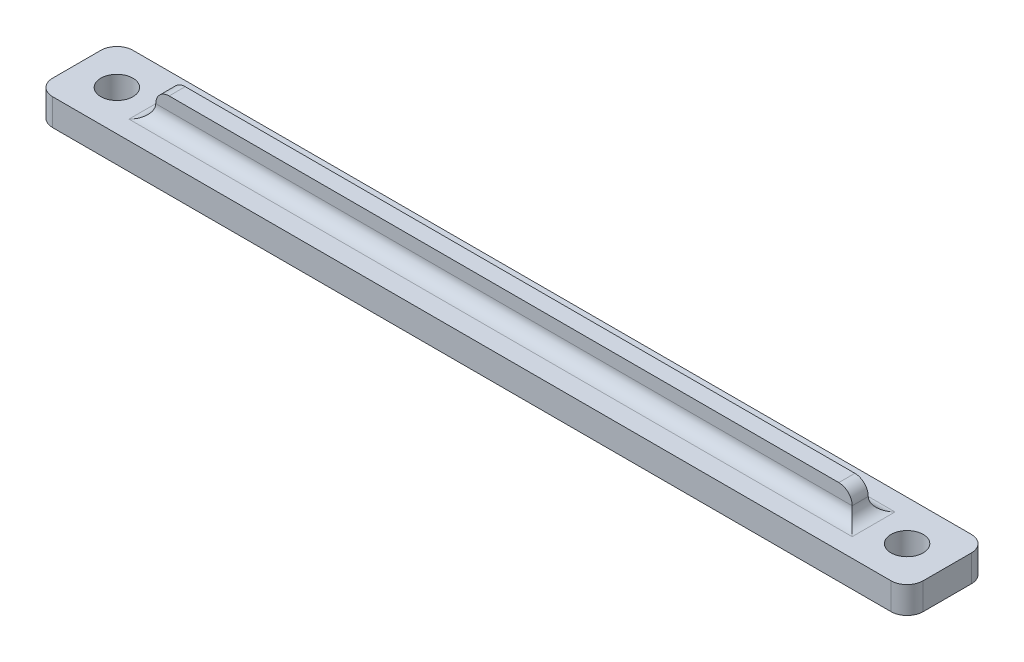
ISO-10303-21;
HEADER;
FILE_DESCRIPTION(('STEP AP214'),'2;1');
FILE_NAME('part.step','',(''),(''),'','','');
FILE_SCHEMA(('AUTOMOTIVE_DESIGN { 1 0 10303 214 1 1 1 1 }'));
ENDSEC;
DATA;
#1=APPLICATION_CONTEXT('core data for automotive mechanical design processes');
#2=APPLICATION_PROTOCOL_DEFINITION('international standard','automotive_design',2000,#1);
#3=PRODUCT_CONTEXT('',#1,'mechanical');
#4=PRODUCT('Part','Part','',(#3));
#5=PRODUCT_RELATED_PRODUCT_CATEGORY('part','',(#4));
#6=PRODUCT_DEFINITION_FORMATION('','',#4);
#7=PRODUCT_DEFINITION_CONTEXT('part definition',#1,'design');
#8=PRODUCT_DEFINITION('design','',#6,#7);
#9=PRODUCT_DEFINITION_SHAPE('','',#8);
#10=(LENGTH_UNIT() NAMED_UNIT(*) SI_UNIT(.MILLI.,.METRE.));
#11=(NAMED_UNIT(*) PLANE_ANGLE_UNIT() SI_UNIT($,.RADIAN.));
#12=(NAMED_UNIT(*) SI_UNIT($,.STERADIAN.) SOLID_ANGLE_UNIT());
#13=UNCERTAINTY_MEASURE_WITH_UNIT(LENGTH_MEASURE(1.E-05),#10,'distance_accuracy_value','');
#14=(GEOMETRIC_REPRESENTATION_CONTEXT(3) GLOBAL_UNCERTAINTY_ASSIGNED_CONTEXT((#13)) GLOBAL_UNIT_ASSIGNED_CONTEXT((#10,
#11,#12)) REPRESENTATION_CONTEXT('',''));
#15=CARTESIAN_POINT('',(0.,0.,0.));
#16=DIRECTION('',(0.,0.,1.));
#17=DIRECTION('',(1.,0.,0.));
#18=AXIS2_PLACEMENT_3D('',#15,#16,#17);
#19=CARTESIAN_POINT('',(0.,2.,0.));
#20=DIRECTION('',(0.,1.,0.));
#21=DIRECTION('',(0.,0.,1.));
#22=AXIS2_PLACEMENT_3D('',#19,#20,#21);
#23=PLANE('',#22);
#24=CARTESIAN_POINT('',(3.,2.,3.));
#25=DIRECTION('',(0.,1.,0.));
#26=DIRECTION('',(0.,0.,1.));
#27=AXIS2_PLACEMENT_3D('',#24,#25,#26);
#28=CIRCLE('',#27,1.2);
#29=CARTESIAN_POINT('',(3.,2.,4.2));
#30=VERTEX_POINT('',#29);
#31=EDGE_CURVE('E266',#30,#30,#28,.T.);
#32=ORIENTED_EDGE('',*,*,#31,.F.);
#33=EDGE_LOOP('',(#32));
#34=FACE_BOUND('',#33,.T.);
#35=CARTESIAN_POINT('',(62.,2.,3.));
#36=DIRECTION('',(0.,1.,0.));
#37=DIRECTION('',(0.,0.,1.));
#38=AXIS2_PLACEMENT_3D('',#35,#36,#37);
#39=CIRCLE('',#38,1.2);
#40=CARTESIAN_POINT('',(62.,2.,4.2));
#41=VERTEX_POINT('',#40);
#42=EDGE_CURVE('E276',#41,#41,#39,.T.);
#43=ORIENTED_EDGE('',*,*,#42,.F.);
#44=EDGE_LOOP('',(#43));
#45=FACE_BOUND('',#44,.T.);
#46=DIRECTION('',(0.,0.,1.));
#47=VECTOR('',#46,1.);
#48=CARTESIAN_POINT('',(0.,2.,0.));
#49=LINE('',#48,#47);
#50=CARTESIAN_POINT('',(0.,2.,1.2));
#51=VERTEX_POINT('',#50);
#52=CARTESIAN_POINT('',(0.,2.,4.8));
#53=VERTEX_POINT('',#52);
#54=EDGE_CURVE('E171',#51,#53,#49,.T.);
#55=ORIENTED_EDGE('',*,*,#54,.T.);
#56=CARTESIAN_POINT('',(1.2,2.,4.8));
#57=DIRECTION('',(0.,1.,0.));
#58=DIRECTION('',(0.,0.,1.));
#59=AXIS2_PLACEMENT_3D('',#56,#57,#58);
#60=CIRCLE('',#59,1.2);
#61=CARTESIAN_POINT('',(1.2,2.,6.));
#62=VERTEX_POINT('',#61);
#63=EDGE_CURVE('E187',#53,#62,#60,.T.);
#64=ORIENTED_EDGE('',*,*,#63,.T.);
#65=DIRECTION('',(1.,0.,0.));
#66=VECTOR('',#65,1.);
#67=CARTESIAN_POINT('',(0.,2.,6.));
#68=LINE('',#67,#66);
#69=CARTESIAN_POINT('',(63.8,2.,6.));
#70=VERTEX_POINT('',#69);
#71=EDGE_CURVE('E153',#62,#70,#68,.T.);
#72=ORIENTED_EDGE('',*,*,#71,.T.);
#73=CARTESIAN_POINT('',(63.8,2.,4.8));
#74=DIRECTION('',(0.,1.,0.));
#75=DIRECTION('',(0.,0.,1.));
#76=AXIS2_PLACEMENT_3D('',#73,#74,#75);
#77=CIRCLE('',#76,1.2);
#78=CARTESIAN_POINT('',(65.,2.,4.8));
#79=VERTEX_POINT('',#78);
#80=EDGE_CURVE('E181',#70,#79,#77,.T.);
#81=ORIENTED_EDGE('',*,*,#80,.T.);
#82=DIRECTION('',(0.,0.,-1.));
#83=VECTOR('',#82,1.);
#84=CARTESIAN_POINT('',(65.,2.,0.));
#85=LINE('',#84,#83);
#86=CARTESIAN_POINT('',(65.,2.,1.2));
#87=VERTEX_POINT('',#86);
#88=EDGE_CURVE('E285',#79,#87,#85,.T.);
#89=ORIENTED_EDGE('',*,*,#88,.T.);
#90=CARTESIAN_POINT('',(63.8,2.,1.2));
#91=DIRECTION('',(0.,1.,0.));
#92=DIRECTION('',(0.,0.,1.));
#93=AXIS2_PLACEMENT_3D('',#90,#91,#92);
#94=CIRCLE('',#93,1.2);
#95=CARTESIAN_POINT('',(63.8,2.,0.));
#96=VERTEX_POINT('',#95);
#97=EDGE_CURVE('E183',#87,#96,#94,.T.);
#98=ORIENTED_EDGE('',*,*,#97,.T.);
#99=DIRECTION('',(-1.,0.,0.));
#100=VECTOR('',#99,1.);
#101=CARTESIAN_POINT('',(0.,2.,0.));
#102=LINE('',#101,#100);
#103=CARTESIAN_POINT('',(1.2,2.,0.));
#104=VERTEX_POINT('',#103);
#105=EDGE_CURVE('E172',#96,#104,#102,.T.);
#106=ORIENTED_EDGE('',*,*,#105,.T.);
#107=CARTESIAN_POINT('',(1.2,2.,1.2));
#108=DIRECTION('',(0.,1.,0.));
#109=DIRECTION('',(0.,0.,1.));
#110=AXIS2_PLACEMENT_3D('',#107,#108,#109);
#111=CIRCLE('',#110,1.2);
#112=EDGE_CURVE('E185',#104,#51,#111,.T.);
#113=ORIENTED_EDGE('',*,*,#112,.T.);
#114=EDGE_LOOP('',(#55,#64,#72,#81,#89,#98,#106,#113));
#115=FACE_BOUND('',#114,.T.);
#116=DIRECTION('',(-1.,0.,0.));
#117=VECTOR('',#116,1.);
#118=CARTESIAN_POINT('',(0.,2.,1.4));
#119=LINE('',#118,#117);
#120=CARTESIAN_POINT('',(5.50000000000001,2.,1.4));
#121=VERTEX_POINT('',#120);
#122=CARTESIAN_POINT('',(59.5,2.,1.4));
#123=VERTEX_POINT('',#122);
#124=EDGE_CURVE('E48',#121,#123,#119,.F.);
#125=ORIENTED_EDGE('',*,*,#124,.T.);
#126=DIRECTION('',(0.,0.,-1.));
#127=VECTOR('',#126,1.);
#128=CARTESIAN_POINT('',(59.5,2.,0.));
#129=LINE('',#128,#127);
#130=CARTESIAN_POINT('',(59.5,2.,4.6));
#131=VERTEX_POINT('',#130);
#132=EDGE_CURVE('E231',#123,#131,#129,.F.);
#133=ORIENTED_EDGE('',*,*,#132,.T.);
#134=DIRECTION('',(1.,0.,0.));
#135=VECTOR('',#134,1.);
#136=CARTESIAN_POINT('',(0.,2.,4.6));
#137=LINE('',#136,#135);
#138=CARTESIAN_POINT('',(5.50000000000001,2.,4.6));
#139=VERTEX_POINT('',#138);
#140=EDGE_CURVE('E56',#131,#139,#137,.F.);
#141=ORIENTED_EDGE('',*,*,#140,.T.);
#142=DIRECTION('',(0.,0.,1.));
#143=VECTOR('',#142,1.);
#144=CARTESIAN_POINT('',(5.50000000000001,2.,0.));
#145=LINE('',#144,#143);
#146=EDGE_CURVE('E229',#139,#121,#145,.F.);
#147=ORIENTED_EDGE('',*,*,#146,.T.);
#148=EDGE_LOOP('',(#125,#133,#141,#147));
#149=FACE_BOUND('',#148,.T.);
#150=ADVANCED_FACE('F33',(#34,#45,#115,#149),#23,.T.);
#151=CARTESIAN_POINT('',(0.,2.,0.));
#152=DIRECTION('',(1.,0.,0.));
#153=DIRECTION('',(0.,0.,-1.));
#154=AXIS2_PLACEMENT_3D('',#151,#152,#153);
#155=PLANE('',#154);
#156=DIRECTION('',(0.,0.,1.));
#157=VECTOR('',#156,1.);
#158=CARTESIAN_POINT('',(0.,0.,0.));
#159=LINE('',#158,#157);
#160=CARTESIAN_POINT('',(0.,0.,1.2));
#161=VERTEX_POINT('',#160);
#162=CARTESIAN_POINT('',(0.,0.,4.8));
#163=VERTEX_POINT('',#162);
#164=EDGE_CURVE('E160',#161,#163,#159,.T.);
#165=ORIENTED_EDGE('',*,*,#164,.T.);
#166=DIRECTION('',(0.,-1.,0.));
#167=VECTOR('',#166,1.);
#168=CARTESIAN_POINT('',(0.,2.,4.8));
#169=LINE('',#168,#167);
#170=EDGE_CURVE('E138',#163,#53,#169,.F.);
#171=ORIENTED_EDGE('',*,*,#170,.T.);
#172=ORIENTED_EDGE('',*,*,#54,.F.);
#173=DIRECTION('',(0.,-1.,0.));
#174=VECTOR('',#173,1.);
#175=CARTESIAN_POINT('',(0.,2.,1.2));
#176=LINE('',#175,#174);
#177=EDGE_CURVE('E143',#51,#161,#176,.T.);
#178=ORIENTED_EDGE('',*,*,#177,.T.);
#179=EDGE_LOOP('',(#165,#171,#172,#178));
#180=FACE_BOUND('',#179,.T.);
#181=ADVANCED_FACE('F300',(#180),#155,.F.);
#182=CARTESIAN_POINT('',(0.,2.,6.));
#183=DIRECTION('',(0.,0.,-1.));
#184=DIRECTION('',(-1.,0.,0.));
#185=AXIS2_PLACEMENT_3D('',#182,#183,#184);
#186=PLANE('',#185);
#187=ORIENTED_EDGE('',*,*,#71,.F.);
#188=DIRECTION('',(0.,-1.,0.));
#189=VECTOR('',#188,1.);
#190=CARTESIAN_POINT('',(1.2,2.,6.));
#191=LINE('',#190,#189);
#192=CARTESIAN_POINT('',(1.2,0.,6.));
#193=VERTEX_POINT('',#192);
#194=EDGE_CURVE('E137',#62,#193,#191,.T.);
#195=ORIENTED_EDGE('',*,*,#194,.T.);
#196=DIRECTION('',(1.,0.,0.));
#197=VECTOR('',#196,1.);
#198=CARTESIAN_POINT('',(0.,0.,6.));
#199=LINE('',#198,#197);
#200=CARTESIAN_POINT('',(63.8,0.,6.));
#201=VERTEX_POINT('',#200);
#202=EDGE_CURVE('E150',#193,#201,#199,.T.);
#203=ORIENTED_EDGE('',*,*,#202,.T.);
#204=DIRECTION('',(0.,-1.,0.));
#205=VECTOR('',#204,1.);
#206=CARTESIAN_POINT('',(63.8,2.,6.));
#207=LINE('',#206,#205);
#208=EDGE_CURVE('E155',#201,#70,#207,.F.);
#209=ORIENTED_EDGE('',*,*,#208,.T.);
#210=EDGE_LOOP('',(#187,#195,#203,#209));
#211=FACE_BOUND('',#210,.T.);
#212=ADVANCED_FACE('F149',(#211),#186,.F.);
#213=CARTESIAN_POINT('',(65.,2.,0.));
#214=DIRECTION('',(-1.,0.,0.));
#215=DIRECTION('',(0.,0.,1.));
#216=AXIS2_PLACEMENT_3D('',#213,#214,#215);
#217=PLANE('',#216);
#218=DIRECTION('',(0.,0.,-1.));
#219=VECTOR('',#218,1.);
#220=CARTESIAN_POINT('',(65.,0.,0.));
#221=LINE('',#220,#219);
#222=CARTESIAN_POINT('',(65.,0.,4.8));
#223=VERTEX_POINT('',#222);
#224=CARTESIAN_POINT('',(65.,0.,1.2));
#225=VERTEX_POINT('',#224);
#226=EDGE_CURVE('E159',#223,#225,#221,.T.);
#227=ORIENTED_EDGE('',*,*,#226,.T.);
#228=DIRECTION('',(0.,-1.,0.));
#229=VECTOR('',#228,1.);
#230=CARTESIAN_POINT('',(65.,2.,1.2));
#231=LINE('',#230,#229);
#232=EDGE_CURVE('E197',#225,#87,#231,.F.);
#233=ORIENTED_EDGE('',*,*,#232,.T.);
#234=ORIENTED_EDGE('',*,*,#88,.F.);
#235=DIRECTION('',(0.,-1.,0.));
#236=VECTOR('',#235,1.);
#237=CARTESIAN_POINT('',(65.,2.,4.8));
#238=LINE('',#237,#236);
#239=EDGE_CURVE('E194',#79,#223,#238,.T.);
#240=ORIENTED_EDGE('',*,*,#239,.T.);
#241=EDGE_LOOP('',(#227,#233,#234,#240));
#242=FACE_BOUND('',#241,.T.);
#243=ADVANCED_FACE('F307',(#242),#217,.F.);
#244=CARTESIAN_POINT('',(0.,2.,0.));
#245=DIRECTION('',(0.,0.,1.));
#246=DIRECTION('',(1.,0.,0.));
#247=AXIS2_PLACEMENT_3D('',#244,#245,#246);
#248=PLANE('',#247);
#249=DIRECTION('',(-1.,0.,0.));
#250=VECTOR('',#249,1.);
#251=CARTESIAN_POINT('',(0.,0.,0.));
#252=LINE('',#251,#250);
#253=CARTESIAN_POINT('',(63.8,0.,0.));
#254=VERTEX_POINT('',#253);
#255=CARTESIAN_POINT('',(1.2,0.,0.));
#256=VERTEX_POINT('',#255);
#257=EDGE_CURVE('E163',#254,#256,#252,.T.);
#258=ORIENTED_EDGE('',*,*,#257,.T.);
#259=DIRECTION('',(0.,-1.,0.));
#260=VECTOR('',#259,1.);
#261=CARTESIAN_POINT('',(1.2,2.,0.));
#262=LINE('',#261,#260);
#263=EDGE_CURVE('E192',#256,#104,#262,.F.);
#264=ORIENTED_EDGE('',*,*,#263,.T.);
#265=ORIENTED_EDGE('',*,*,#105,.F.);
#266=DIRECTION('',(0.,-1.,0.));
#267=VECTOR('',#266,1.);
#268=CARTESIAN_POINT('',(63.8,2.,0.));
#269=LINE('',#268,#267);
#270=EDGE_CURVE('E189',#96,#254,#269,.T.);
#271=ORIENTED_EDGE('',*,*,#270,.T.);
#272=EDGE_LOOP('',(#258,#264,#265,#271));
#273=FACE_BOUND('',#272,.T.);
#274=ADVANCED_FACE('F302',(#273),#248,.F.);
#275=CARTESIAN_POINT('',(0.,0.,0.));
#276=DIRECTION('',(0.,1.,0.));
#277=DIRECTION('',(0.,0.,1.));
#278=AXIS2_PLACEMENT_3D('',#275,#276,#277);
#279=PLANE('',#278);
#280=CARTESIAN_POINT('',(45.,0.,3.));
#281=DIRECTION('',(0.,-1.,0.));
#282=DIRECTION('',(0.,0.,-1.));
#283=AXIS2_PLACEMENT_3D('',#280,#281,#282);
#284=CIRCLE('',#283,2.15);
#285=CARTESIAN_POINT('',(45.,0.,0.849999999999999));
#286=VERTEX_POINT('',#285);
#287=EDGE_CURVE('E536',#286,#286,#284,.T.);
#288=ORIENTED_EDGE('',*,*,#287,.F.);
#289=EDGE_LOOP('',(#288));
#290=FACE_BOUND('',#289,.T.);
#291=CARTESIAN_POINT('',(20.,0.,3.));
#292=DIRECTION('',(0.,-1.,0.));
#293=DIRECTION('',(0.,0.,-1.));
#294=AXIS2_PLACEMENT_3D('',#291,#292,#293);
#295=CIRCLE('',#294,2.15);
#296=CARTESIAN_POINT('',(20.,0.,0.850000000000002));
#297=VERTEX_POINT('',#296);
#298=EDGE_CURVE('E548',#297,#297,#295,.T.);
#299=ORIENTED_EDGE('',*,*,#298,.F.);
#300=EDGE_LOOP('',(#299));
#301=FACE_BOUND('',#300,.T.);
#302=CARTESIAN_POINT('',(3.,0.,3.));
#303=DIRECTION('',(0.,1.,0.));
#304=DIRECTION('',(0.,0.,1.));
#305=AXIS2_PLACEMENT_3D('',#302,#303,#304);
#306=CIRCLE('',#305,1.2);
#307=CARTESIAN_POINT('',(3.,0.,4.2));
#308=VERTEX_POINT('',#307);
#309=EDGE_CURVE('E269',#308,#308,#306,.T.);
#310=ORIENTED_EDGE('',*,*,#309,.T.);
#311=EDGE_LOOP('',(#310));
#312=FACE_BOUND('',#311,.T.);
#313=CARTESIAN_POINT('',(62.,0.,3.));
#314=DIRECTION('',(0.,1.,0.));
#315=DIRECTION('',(0.,0.,1.));
#316=AXIS2_PLACEMENT_3D('',#313,#314,#315);
#317=CIRCLE('',#316,1.2);
#318=CARTESIAN_POINT('',(62.,0.,4.2));
#319=VERTEX_POINT('',#318);
#320=EDGE_CURVE('E165',#319,#319,#317,.T.);
#321=ORIENTED_EDGE('',*,*,#320,.T.);
#322=EDGE_LOOP('',(#321));
#323=FACE_BOUND('',#322,.T.);
#324=ORIENTED_EDGE('',*,*,#202,.F.);
#325=CARTESIAN_POINT('',(1.2,0.,4.8));
#326=DIRECTION('',(0.,1.,0.));
#327=DIRECTION('',(0.,0.,1.));
#328=AXIS2_PLACEMENT_3D('',#325,#326,#327);
#329=CIRCLE('',#328,1.2);
#330=EDGE_CURVE('E133',#193,#163,#329,.F.);
#331=ORIENTED_EDGE('',*,*,#330,.T.);
#332=ORIENTED_EDGE('',*,*,#164,.F.);
#333=CARTESIAN_POINT('',(1.2,0.,1.2));
#334=DIRECTION('',(0.,1.,0.));
#335=DIRECTION('',(0.,0.,1.));
#336=AXIS2_PLACEMENT_3D('',#333,#334,#335);
#337=CIRCLE('',#336,1.2);
#338=EDGE_CURVE('E144',#161,#256,#337,.F.);
#339=ORIENTED_EDGE('',*,*,#338,.T.);
#340=ORIENTED_EDGE('',*,*,#257,.F.);
#341=CARTESIAN_POINT('',(63.8,0.,1.2));
#342=DIRECTION('',(0.,1.,0.));
#343=DIRECTION('',(0.,0.,1.));
#344=AXIS2_PLACEMENT_3D('',#341,#342,#343);
#345=CIRCLE('',#344,1.2);
#346=EDGE_CURVE('E175',#254,#225,#345,.F.);
#347=ORIENTED_EDGE('',*,*,#346,.T.);
#348=ORIENTED_EDGE('',*,*,#226,.F.);
#349=CARTESIAN_POINT('',(63.8,0.,4.8));
#350=DIRECTION('',(0.,1.,0.));
#351=DIRECTION('',(0.,0.,1.));
#352=AXIS2_PLACEMENT_3D('',#349,#350,#351);
#353=CIRCLE('',#352,1.2);
#354=EDGE_CURVE('E154',#223,#201,#353,.F.);
#355=ORIENTED_EDGE('',*,*,#354,.T.);
#356=EDGE_LOOP('',(#324,#331,#332,#339,#340,#347,#348,#355));
#357=FACE_BOUND('',#356,.T.);
#358=ADVANCED_FACE('F157',(#290,#301,#312,#323,#357),#279,.F.);
#359=CARTESIAN_POINT('',(62.,0.,3.));
#360=DIRECTION('',(0.,1.,0.));
#361=DIRECTION('',(0.,0.,1.));
#362=AXIS2_PLACEMENT_3D('',#359,#360,#361);
#363=CYLINDRICAL_SURFACE('',#362,1.2);
#364=ORIENTED_EDGE('',*,*,#320,.F.);
#365=EDGE_LOOP('',(#364));
#366=FACE_BOUND('',#365,.T.);
#367=ORIENTED_EDGE('',*,*,#42,.T.);
#368=EDGE_LOOP('',(#367));
#369=FACE_BOUND('',#368,.T.);
#370=ADVANCED_FACE('F333',(#366,#369),#363,.F.);
#371=CARTESIAN_POINT('',(3.,0.,3.));
#372=DIRECTION('',(0.,1.,0.));
#373=DIRECTION('',(0.,0.,1.));
#374=AXIS2_PLACEMENT_3D('',#371,#372,#373);
#375=CYLINDRICAL_SURFACE('',#374,1.2);
#376=ORIENTED_EDGE('',*,*,#309,.F.);
#377=EDGE_LOOP('',(#376));
#378=FACE_BOUND('',#377,.T.);
#379=ORIENTED_EDGE('',*,*,#31,.T.);
#380=EDGE_LOOP('',(#379));
#381=FACE_BOUND('',#380,.T.);
#382=ADVANCED_FACE('F387',(#378,#381),#375,.F.);
#383=CARTESIAN_POINT('',(6.50000000000001,4.,3.6));
#384=DIRECTION('',(0.,0.,-1.));
#385=DIRECTION('',(-1.,0.,0.));
#386=AXIS2_PLACEMENT_3D('',#383,#384,#385);
#387=PLANE('',#386);
#388=CARTESIAN_POINT('',(7.50000000000001,3.,3.6));
#389=DIRECTION('',(0.,0.,-1.));
#390=DIRECTION('',(-1.,0.,0.));
#391=AXIS2_PLACEMENT_3D('',#388,#389,#390);
#392=CIRCLE('',#391,1.);
#393=CARTESIAN_POINT('',(7.50000000000001,4.,3.6));
#394=VERTEX_POINT('',#393);
#395=CARTESIAN_POINT('',(6.50000000000001,3.,3.6));
#396=VERTEX_POINT('',#395);
#397=EDGE_CURVE('E213',#394,#396,#392,.F.);
#398=ORIENTED_EDGE('',*,*,#397,.T.);
#399=DIRECTION('',(1.,0.,0.));
#400=VECTOR('',#399,1.);
#401=CARTESIAN_POINT('',(6.50000000000001,3.,3.6));
#402=LINE('',#401,#400);
#403=CARTESIAN_POINT('',(58.5,3.,3.6));
#404=VERTEX_POINT('',#403);
#405=EDGE_CURVE('E221',#396,#404,#402,.T.);
#406=ORIENTED_EDGE('',*,*,#405,.T.);
#407=CARTESIAN_POINT('',(57.5,3.,3.6));
#408=DIRECTION('',(0.,0.,-1.));
#409=DIRECTION('',(-1.,0.,0.));
#410=AXIS2_PLACEMENT_3D('',#407,#408,#409);
#411=CIRCLE('',#410,1.);
#412=CARTESIAN_POINT('',(57.5,4.,3.6));
#413=VERTEX_POINT('',#412);
#414=EDGE_CURVE('E216',#404,#413,#411,.F.);
#415=ORIENTED_EDGE('',*,*,#414,.T.);
#416=DIRECTION('',(1.,0.,0.));
#417=VECTOR('',#416,1.);
#418=CARTESIAN_POINT('',(6.50000000000001,4.,3.6));
#419=LINE('',#418,#417);
#420=EDGE_CURVE('E262',#394,#413,#419,.T.);
#421=ORIENTED_EDGE('',*,*,#420,.F.);
#422=EDGE_LOOP('',(#398,#406,#415,#421));
#423=FACE_BOUND('',#422,.T.);
#424=ADVANCED_FACE('F248',(#423),#387,.F.);
#425=CARTESIAN_POINT('',(6.50000000000001,4.,2.4));
#426=DIRECTION('',(0.,0.,1.));
#427=DIRECTION('',(1.,0.,0.));
#428=AXIS2_PLACEMENT_3D('',#425,#426,#427);
#429=PLANE('',#428);
#430=CARTESIAN_POINT('',(57.5,3.,2.4));
#431=DIRECTION('',(0.,0.,1.));
#432=DIRECTION('',(1.,0.,0.));
#433=AXIS2_PLACEMENT_3D('',#430,#431,#432);
#434=CIRCLE('',#433,1.);
#435=CARTESIAN_POINT('',(57.5,4.,2.4));
#436=VERTEX_POINT('',#435);
#437=CARTESIAN_POINT('',(58.5,3.,2.4));
#438=VERTEX_POINT('',#437);
#439=EDGE_CURVE('E207',#436,#438,#434,.F.);
#440=ORIENTED_EDGE('',*,*,#439,.T.);
#441=DIRECTION('',(-1.,0.,0.));
#442=VECTOR('',#441,1.);
#443=CARTESIAN_POINT('',(6.50000000000001,3.,2.4));
#444=LINE('',#443,#442);
#445=CARTESIAN_POINT('',(6.50000000000001,3.,2.4));
#446=VERTEX_POINT('',#445);
#447=EDGE_CURVE('E226',#438,#446,#444,.T.);
#448=ORIENTED_EDGE('',*,*,#447,.T.);
#449=CARTESIAN_POINT('',(7.50000000000001,3.,2.4));
#450=DIRECTION('',(0.,0.,1.));
#451=DIRECTION('',(1.,0.,0.));
#452=AXIS2_PLACEMENT_3D('',#449,#450,#451);
#453=CIRCLE('',#452,1.);
#454=CARTESIAN_POINT('',(7.50000000000001,4.,2.4));
#455=VERTEX_POINT('',#454);
#456=EDGE_CURVE('E205',#446,#455,#453,.F.);
#457=ORIENTED_EDGE('',*,*,#456,.T.);
#458=DIRECTION('',(-1.,0.,0.));
#459=VECTOR('',#458,1.);
#460=CARTESIAN_POINT('',(6.50000000000001,4.,2.4));
#461=LINE('',#460,#459);
#462=EDGE_CURVE('E260',#436,#455,#461,.T.);
#463=ORIENTED_EDGE('',*,*,#462,.F.);
#464=EDGE_LOOP('',(#440,#448,#457,#463));
#465=FACE_BOUND('',#464,.T.);
#466=ADVANCED_FACE('F264',(#465),#429,.F.);
#467=CARTESIAN_POINT('',(0.,4.,0.));
#468=DIRECTION('',(0.,1.,0.));
#469=DIRECTION('',(0.,0.,1.));
#470=AXIS2_PLACEMENT_3D('',#467,#468,#469);
#471=PLANE('',#470);
#472=ORIENTED_EDGE('',*,*,#420,.T.);
#473=DIRECTION('',(0.,0.,-1.));
#474=VECTOR('',#473,1.);
#475=CARTESIAN_POINT('',(57.5,4.,2.4));
#476=LINE('',#475,#474);
#477=EDGE_CURVE('E202',#413,#436,#476,.T.);
#478=ORIENTED_EDGE('',*,*,#477,.T.);
#479=ORIENTED_EDGE('',*,*,#462,.T.);
#480=DIRECTION('',(0.,0.,1.));
#481=VECTOR('',#480,1.);
#482=CARTESIAN_POINT('',(7.50000000000001,4.,3.6));
#483=LINE('',#482,#481);
#484=EDGE_CURVE('E199',#455,#394,#483,.T.);
#485=ORIENTED_EDGE('',*,*,#484,.T.);
#486=EDGE_LOOP('',(#472,#478,#479,#485));
#487=FACE_BOUND('',#486,.T.);
#488=ADVANCED_FACE('F259',(#487),#471,.T.);
#489=CARTESIAN_POINT('',(1.2,2.,4.8));
#490=DIRECTION('',(0.,-1.,0.));
#491=DIRECTION('',(0.,0.,-1.));
#492=AXIS2_PLACEMENT_3D('',#489,#490,#491);
#493=CYLINDRICAL_SURFACE('',#492,1.2);
#494=ORIENTED_EDGE('',*,*,#63,.F.);
#495=ORIENTED_EDGE('',*,*,#170,.F.);
#496=ORIENTED_EDGE('',*,*,#330,.F.);
#497=ORIENTED_EDGE('',*,*,#194,.F.);
#498=EDGE_LOOP('',(#494,#495,#496,#497));
#499=FACE_BOUND('',#498,.T.);
#500=ADVANCED_FACE('F136',(#499),#493,.T.);
#501=CARTESIAN_POINT('',(1.2,2.,1.2));
#502=DIRECTION('',(0.,-1.,0.));
#503=DIRECTION('',(0.,0.,-1.));
#504=AXIS2_PLACEMENT_3D('',#501,#502,#503);
#505=CYLINDRICAL_SURFACE('',#504,1.2);
#506=ORIENTED_EDGE('',*,*,#112,.F.);
#507=ORIENTED_EDGE('',*,*,#263,.F.);
#508=ORIENTED_EDGE('',*,*,#338,.F.);
#509=ORIENTED_EDGE('',*,*,#177,.F.);
#510=EDGE_LOOP('',(#506,#507,#508,#509));
#511=FACE_BOUND('',#510,.T.);
#512=ADVANCED_FACE('F298',(#511),#505,.T.);
#513=CARTESIAN_POINT('',(63.8,2.,1.2));
#514=DIRECTION('',(0.,-1.,0.));
#515=DIRECTION('',(0.,0.,-1.));
#516=AXIS2_PLACEMENT_3D('',#513,#514,#515);
#517=CYLINDRICAL_SURFACE('',#516,1.2);
#518=ORIENTED_EDGE('',*,*,#97,.F.);
#519=ORIENTED_EDGE('',*,*,#232,.F.);
#520=ORIENTED_EDGE('',*,*,#346,.F.);
#521=ORIENTED_EDGE('',*,*,#270,.F.);
#522=EDGE_LOOP('',(#518,#519,#520,#521));
#523=FACE_BOUND('',#522,.T.);
#524=ADVANCED_FACE('F304',(#523),#517,.T.);
#525=CARTESIAN_POINT('',(63.8,2.,4.8));
#526=DIRECTION('',(0.,-1.,0.));
#527=DIRECTION('',(0.,0.,-1.));
#528=AXIS2_PLACEMENT_3D('',#525,#526,#527);
#529=CYLINDRICAL_SURFACE('',#528,1.2);
#530=ORIENTED_EDGE('',*,*,#80,.F.);
#531=ORIENTED_EDGE('',*,*,#208,.F.);
#532=ORIENTED_EDGE('',*,*,#354,.F.);
#533=ORIENTED_EDGE('',*,*,#239,.F.);
#534=EDGE_LOOP('',(#530,#531,#532,#533));
#535=FACE_BOUND('',#534,.T.);
#536=ADVANCED_FACE('F312',(#535),#529,.T.);
#537=CARTESIAN_POINT('',(57.5,3.,0.));
#538=DIRECTION('',(0.,0.,1.));
#539=DIRECTION('',(1.,0.,0.));
#540=AXIS2_PLACEMENT_3D('',#537,#538,#539);
#541=CYLINDRICAL_SURFACE('',#540,1.);
#542=ORIENTED_EDGE('',*,*,#414,.F.);
#543=DIRECTION('',(0.,0.,-1.));
#544=VECTOR('',#543,1.);
#545=CARTESIAN_POINT('',(58.5,3.,3.6));
#546=LINE('',#545,#544);
#547=EDGE_CURVE('E210',#438,#404,#546,.F.);
#548=ORIENTED_EDGE('',*,*,#547,.F.);
#549=ORIENTED_EDGE('',*,*,#439,.F.);
#550=ORIENTED_EDGE('',*,*,#477,.F.);
#551=EDGE_LOOP('',(#542,#548,#549,#550));
#552=FACE_BOUND('',#551,.T.);
#553=ADVANCED_FACE('F254',(#552),#541,.T.);
#554=CARTESIAN_POINT('',(7.50000000000001,3.,0.));
#555=DIRECTION('',(0.,0.,-1.));
#556=DIRECTION('',(-1.,0.,0.));
#557=AXIS2_PLACEMENT_3D('',#554,#555,#556);
#558=CYLINDRICAL_SURFACE('',#557,1.);
#559=ORIENTED_EDGE('',*,*,#456,.F.);
#560=DIRECTION('',(0.,0.,1.));
#561=VECTOR('',#560,1.);
#562=CARTESIAN_POINT('',(6.50000000000001,3.,2.4));
#563=LINE('',#562,#561);
#564=EDGE_CURVE('E218',#396,#446,#563,.F.);
#565=ORIENTED_EDGE('',*,*,#564,.F.);
#566=ORIENTED_EDGE('',*,*,#397,.F.);
#567=ORIENTED_EDGE('',*,*,#484,.F.);
#568=EDGE_LOOP('',(#559,#565,#566,#567));
#569=FACE_BOUND('',#568,.T.);
#570=ADVANCED_FACE('F319',(#569),#558,.T.);
#571=CARTESIAN_POINT('',(6.50000000000001,3.,4.6));
#572=DIRECTION('',(1.,0.,0.));
#573=DIRECTION('',(0.,0.,-1.));
#574=AXIS2_PLACEMENT_3D('',#571,#572,#573);
#575=CYLINDRICAL_SURFACE('',#574,1.);
#576=ORIENTED_EDGE('',*,*,#405,.F.);
#577=CARTESIAN_POINT('',(5.50000000000001,3.,4.6));
#578=DIRECTION('',(0.707106781186547,0.,0.707106781186547));
#579=DIRECTION('',(0.707106781186547,0.,-0.707106781186547));
#580=AXIS2_PLACEMENT_3D('',#577,#578,#579);
#581=ELLIPSE('',#580,1.41421356237309,1.);
#582=EDGE_CURVE('E41',#396,#139,#581,.F.);
#583=ORIENTED_EDGE('',*,*,#582,.T.);
#584=ORIENTED_EDGE('',*,*,#140,.F.);
#585=CARTESIAN_POINT('',(59.5,3.,4.6));
#586=DIRECTION('',(0.707106781186547,0.,-0.707106781186547));
#587=DIRECTION('',(0.707106781186547,0.,0.707106781186547));
#588=AXIS2_PLACEMENT_3D('',#585,#586,#587);
#589=ELLIPSE('',#588,1.41421356237309,1.);
#590=EDGE_CURVE('E235',#131,#404,#589,.T.);
#591=ORIENTED_EDGE('',*,*,#590,.T.);
#592=EDGE_LOOP('',(#576,#583,#584,#591));
#593=FACE_BOUND('',#592,.T.);
#594=ADVANCED_FACE('F238',(#593),#575,.F.);
#595=CARTESIAN_POINT('',(6.50000000000001,3.,1.4));
#596=DIRECTION('',(-1.,0.,0.));
#597=DIRECTION('',(0.,0.,1.));
#598=AXIS2_PLACEMENT_3D('',#595,#596,#597);
#599=CYLINDRICAL_SURFACE('',#598,1.);
#600=ORIENTED_EDGE('',*,*,#447,.F.);
#601=CARTESIAN_POINT('',(59.5,3.,1.4));
#602=DIRECTION('',(-0.707106781186547,0.,-0.707106781186547));
#603=DIRECTION('',(-0.707106781186547,0.,0.707106781186547));
#604=AXIS2_PLACEMENT_3D('',#601,#602,#603);
#605=ELLIPSE('',#604,1.41421356237309,1.);
#606=EDGE_CURVE('E233',#438,#123,#605,.F.);
#607=ORIENTED_EDGE('',*,*,#606,.T.);
#608=ORIENTED_EDGE('',*,*,#124,.F.);
#609=CARTESIAN_POINT('',(5.50000000000001,3.,1.4));
#610=DIRECTION('',(-0.707106781186547,0.,0.707106781186547));
#611=DIRECTION('',(-0.707106781186547,0.,-0.707106781186547));
#612=AXIS2_PLACEMENT_3D('',#609,#610,#611);
#613=ELLIPSE('',#612,1.41421356237309,1.);
#614=EDGE_CURVE('E11',#121,#446,#613,.T.);
#615=ORIENTED_EDGE('',*,*,#614,.T.);
#616=EDGE_LOOP('',(#600,#607,#608,#615));
#617=FACE_BOUND('',#616,.T.);
#618=ADVANCED_FACE('F417',(#617),#599,.F.);
#619=CARTESIAN_POINT('',(59.5,3.,2.4));
#620=DIRECTION('',(0.,0.,-1.));
#621=DIRECTION('',(-1.,0.,0.));
#622=AXIS2_PLACEMENT_3D('',#619,#620,#621);
#623=CYLINDRICAL_SURFACE('',#622,1.);
#624=ORIENTED_EDGE('',*,*,#590,.F.);
#625=ORIENTED_EDGE('',*,*,#132,.F.);
#626=ORIENTED_EDGE('',*,*,#606,.F.);
#627=ORIENTED_EDGE('',*,*,#547,.T.);
#628=EDGE_LOOP('',(#624,#625,#626,#627));
#629=FACE_BOUND('',#628,.T.);
#630=ADVANCED_FACE('F244',(#629),#623,.F.);
#631=CARTESIAN_POINT('',(5.50000000000001,3.,2.4));
#632=DIRECTION('',(0.,0.,1.));
#633=DIRECTION('',(1.,0.,0.));
#634=AXIS2_PLACEMENT_3D('',#631,#632,#633);
#635=CYLINDRICAL_SURFACE('',#634,1.);
#636=ORIENTED_EDGE('',*,*,#614,.F.);
#637=ORIENTED_EDGE('',*,*,#146,.F.);
#638=ORIENTED_EDGE('',*,*,#582,.F.);
#639=ORIENTED_EDGE('',*,*,#564,.T.);
#640=EDGE_LOOP('',(#636,#637,#638,#639));
#641=FACE_BOUND('',#640,.T.);
#642=ADVANCED_FACE('F35',(#641),#635,.F.);
#643=CARTESIAN_POINT('',(20.,0.8,3.));
#644=DIRECTION('',(0.,-1.,0.));
#645=DIRECTION('',(0.,0.,-1.));
#646=AXIS2_PLACEMENT_3D('',#643,#644,#645);
#647=CYLINDRICAL_SURFACE('',#646,2.15);
#648=CARTESIAN_POINT('',(20.,0.8,3.));
#649=DIRECTION('',(0.,-1.,0.));
#650=DIRECTION('',(0.,0.,-1.));
#651=AXIS2_PLACEMENT_3D('',#648,#649,#650);
#652=CIRCLE('',#651,2.15);
#653=CARTESIAN_POINT('',(20.,0.8,0.850000000000002));
#654=VERTEX_POINT('',#653);
#655=EDGE_CURVE('E271',#654,#654,#652,.T.);
#656=ORIENTED_EDGE('',*,*,#655,.F.);
#657=EDGE_LOOP('',(#656));
#658=FACE_BOUND('',#657,.T.);
#659=ORIENTED_EDGE('',*,*,#298,.T.);
#660=EDGE_LOOP('',(#659));
#661=FACE_BOUND('',#660,.T.);
#662=ADVANCED_FACE('F442',(#658,#661),#647,.F.);
#663=CARTESIAN_POINT('',(20.,0.8,3.));
#664=DIRECTION('',(0.,-1.,0.));
#665=DIRECTION('',(0.,0.,-1.));
#666=AXIS2_PLACEMENT_3D('',#663,#664,#665);
#667=PLANE('',#666);
#668=CARTESIAN_POINT('',(20.,0.8,3.));
#669=DIRECTION('',(0.,-1.,0.));
#670=DIRECTION('',(0.,0.,-1.));
#671=AXIS2_PLACEMENT_3D('',#668,#669,#670);
#672=CIRCLE('',#671,1.55);
#673=CARTESIAN_POINT('',(20.,0.8,1.45));
#674=VERTEX_POINT('',#673);
#675=EDGE_CURVE('E545',#674,#674,#672,.T.);
#676=ORIENTED_EDGE('',*,*,#675,.F.);
#677=EDGE_LOOP('',(#676));
#678=FACE_BOUND('',#677,.T.);
#679=ORIENTED_EDGE('',*,*,#655,.T.);
#680=EDGE_LOOP('',(#679));
#681=FACE_BOUND('',#680,.T.);
#682=ADVANCED_FACE('F460',(#678,#681),#667,.T.);
#683=CARTESIAN_POINT('',(20.,0.8,3.));
#684=DIRECTION('',(0.,-1.,0.));
#685=DIRECTION('',(0.,0.,-1.));
#686=AXIS2_PLACEMENT_3D('',#683,#684,#685);
#687=CYLINDRICAL_SURFACE('',#686,1.55);
#688=ORIENTED_EDGE('',*,*,#675,.T.);
#689=EDGE_LOOP('',(#688));
#690=FACE_BOUND('',#689,.T.);
#691=CARTESIAN_POINT('',(20.,0.,3.));
#692=DIRECTION('',(0.,-1.,0.));
#693=DIRECTION('',(0.,0.,-1.));
#694=AXIS2_PLACEMENT_3D('',#691,#692,#693);
#695=CIRCLE('',#694,1.55);
#696=CARTESIAN_POINT('',(20.,0.,1.45));
#697=VERTEX_POINT('',#696);
#698=EDGE_CURVE('E542',#697,#697,#695,.T.);
#699=ORIENTED_EDGE('',*,*,#698,.F.);
#700=EDGE_LOOP('',(#699));
#701=FACE_BOUND('',#700,.T.);
#702=ADVANCED_FACE('F471',(#690,#701),#687,.T.);
#703=ORIENTED_EDGE('',*,*,#698,.T.);
#704=EDGE_LOOP('',(#703));
#705=FACE_BOUND('',#704,.T.);
#706=ADVANCED_FACE('F339',(#705),#279,.F.);
#707=CARTESIAN_POINT('',(45.,0.8,3.));
#708=DIRECTION('',(0.,-1.,0.));
#709=DIRECTION('',(0.,0.,-1.));
#710=AXIS2_PLACEMENT_3D('',#707,#708,#709);
#711=CYLINDRICAL_SURFACE('',#710,2.15);
#712=CARTESIAN_POINT('',(45.,0.8,3.));
#713=DIRECTION('',(0.,-1.,0.));
#714=DIRECTION('',(0.,0.,-1.));
#715=AXIS2_PLACEMENT_3D('',#712,#713,#714);
#716=CIRCLE('',#715,2.15);
#717=CARTESIAN_POINT('',(45.,0.8,0.849999999999999));
#718=VERTEX_POINT('',#717);
#719=EDGE_CURVE('E539',#718,#718,#716,.T.);
#720=ORIENTED_EDGE('',*,*,#719,.F.);
#721=EDGE_LOOP('',(#720));
#722=FACE_BOUND('',#721,.T.);
#723=ORIENTED_EDGE('',*,*,#287,.T.);
#724=EDGE_LOOP('',(#723));
#725=FACE_BOUND('',#724,.T.);
#726=ADVANCED_FACE('F490',(#722,#725),#711,.F.);
#727=CARTESIAN_POINT('',(45.,0.8,3.));
#728=DIRECTION('',(0.,-1.,0.));
#729=DIRECTION('',(0.,0.,-1.));
#730=AXIS2_PLACEMENT_3D('',#727,#728,#729);
#731=PLANE('',#730);
#732=CARTESIAN_POINT('',(45.,0.8,3.));
#733=DIRECTION('',(0.,-1.,0.));
#734=DIRECTION('',(0.,0.,-1.));
#735=AXIS2_PLACEMENT_3D('',#732,#733,#734);
#736=CIRCLE('',#735,1.55);
#737=CARTESIAN_POINT('',(45.,0.8,1.45));
#738=VERTEX_POINT('',#737);
#739=EDGE_CURVE('E533',#738,#738,#736,.T.);
#740=ORIENTED_EDGE('',*,*,#739,.F.);
#741=EDGE_LOOP('',(#740));
#742=FACE_BOUND('',#741,.T.);
#743=ORIENTED_EDGE('',*,*,#719,.T.);
#744=EDGE_LOOP('',(#743));
#745=FACE_BOUND('',#744,.T.);
#746=ADVANCED_FACE('F498',(#742,#745),#731,.T.);
#747=CARTESIAN_POINT('',(45.,0.8,3.));
#748=DIRECTION('',(0.,-1.,0.));
#749=DIRECTION('',(0.,0.,-1.));
#750=AXIS2_PLACEMENT_3D('',#747,#748,#749);
#751=CYLINDRICAL_SURFACE('',#750,1.55);
#752=ORIENTED_EDGE('',*,*,#739,.T.);
#753=EDGE_LOOP('',(#752));
#754=FACE_BOUND('',#753,.T.);
#755=CARTESIAN_POINT('',(45.,0.,3.));
#756=DIRECTION('',(0.,-1.,0.));
#757=DIRECTION('',(0.,0.,-1.));
#758=AXIS2_PLACEMENT_3D('',#755,#756,#757);
#759=CIRCLE('',#758,1.55);
#760=CARTESIAN_POINT('',(45.,0.,1.45));
#761=VERTEX_POINT('',#760);
#762=EDGE_CURVE('E531',#761,#761,#759,.T.);
#763=ORIENTED_EDGE('',*,*,#762,.F.);
#764=EDGE_LOOP('',(#763));
#765=FACE_BOUND('',#764,.T.);
#766=ADVANCED_FACE('F508',(#754,#765),#751,.T.);
#767=ORIENTED_EDGE('',*,*,#762,.T.);
#768=EDGE_LOOP('',(#767));
#769=FACE_BOUND('',#768,.T.);
#770=ADVANCED_FACE('F338',(#769),#279,.F.);
#771=CLOSED_SHELL('',(#150,#181,#212,#243,#274,#358,#370,#382,#424,#466,#488,#500,#512,#524,
#536,#553,#570,#594,#618,#630,#642,#662,#682,#702,#706,#726,#746,#766,#770));
#772=MANIFOLD_SOLID_BREP('B2',#771);
#773=ADVANCED_BREP_SHAPE_REPRESENTATION('',(#18,#772),#14);
#774=SHAPE_DEFINITION_REPRESENTATION(#9,#773);
ENDSEC;
END-ISO-10303-21;
